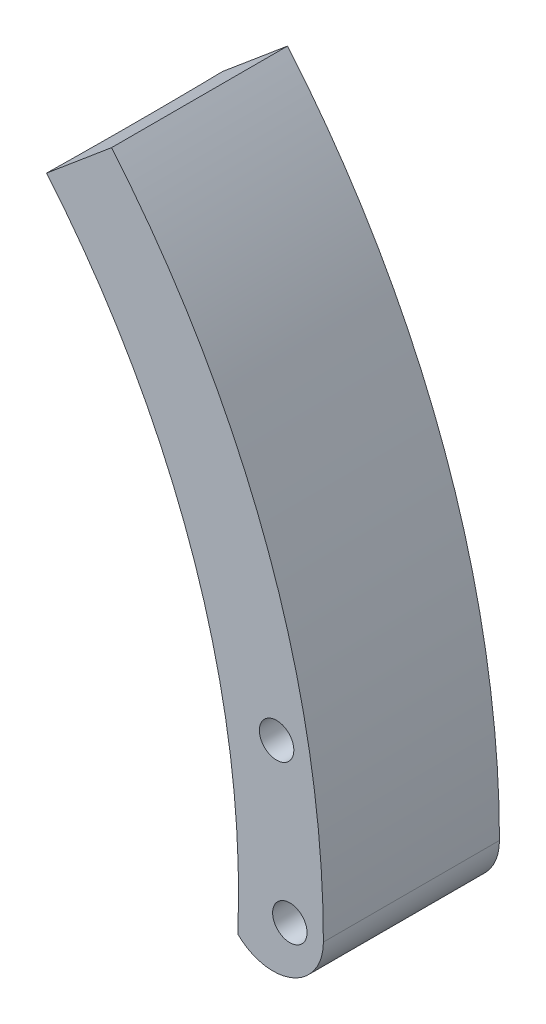
ISO-10303-21;
HEADER;
FILE_DESCRIPTION(('STEP AP214'),'2;1');
FILE_NAME('part.step','',(''),(''),'','','');
FILE_SCHEMA(('AUTOMOTIVE_DESIGN { 1 0 10303 214 1 1 1 1 }'));
ENDSEC;
DATA;
#1=APPLICATION_CONTEXT('core data for automotive mechanical design processes');
#2=APPLICATION_PROTOCOL_DEFINITION('international standard','automotive_design',2000,#1);
#3=PRODUCT_CONTEXT('',#1,'mechanical');
#4=PRODUCT('Part','Part','',(#3));
#5=PRODUCT_RELATED_PRODUCT_CATEGORY('part','',(#4));
#6=PRODUCT_DEFINITION_FORMATION('','',#4);
#7=PRODUCT_DEFINITION_CONTEXT('part definition',#1,'design');
#8=PRODUCT_DEFINITION('design','',#6,#7);
#9=PRODUCT_DEFINITION_SHAPE('','',#8);
#10=(LENGTH_UNIT() NAMED_UNIT(*) SI_UNIT(.MILLI.,.METRE.));
#11=(NAMED_UNIT(*) PLANE_ANGLE_UNIT() SI_UNIT($,.RADIAN.));
#12=(NAMED_UNIT(*) SI_UNIT($,.STERADIAN.) SOLID_ANGLE_UNIT());
#13=UNCERTAINTY_MEASURE_WITH_UNIT(LENGTH_MEASURE(1.E-05),#10,'distance_accuracy_value','');
#14=(GEOMETRIC_REPRESENTATION_CONTEXT(3) GLOBAL_UNCERTAINTY_ASSIGNED_CONTEXT((#13)) GLOBAL_UNIT_ASSIGNED_CONTEXT((#10,
#11,#12)) REPRESENTATION_CONTEXT('',''));
#15=CARTESIAN_POINT('',(0.,0.,0.));
#16=DIRECTION('',(0.,0.,1.));
#17=DIRECTION('',(1.,0.,0.));
#18=AXIS2_PLACEMENT_3D('',#15,#16,#17);
#19=CARTESIAN_POINT('',(161.925,0.,-16.66875));
#20=DIRECTION('',(0.,0.,1.));
#21=DIRECTION('',(1.,0.,0.));
#22=AXIS2_PLACEMENT_3D('',#19,#20,#21);
#23=CYLINDRICAL_SURFACE('',#22,9.52500000000001);
#24=CARTESIAN_POINT('',(155.240875398303,-6.78587527950434,-16.66895));
#25=CARTESIAN_POINT('',(155.292003784145,-6.83622169072267,-16.2737696493296));
#26=CARTESIAN_POINT('',(155.341380564089,-6.88373509715529,-15.8780088997003));
#27=CARTESIAN_POINT('',(155.436588080032,-6.97355526704699,-15.0854829875638));
#28=CARTESIAN_POINT('',(155.482418926421,-7.01586219261438,-14.6887178567215));
#29=CARTESIAN_POINT('',(155.570488783143,-7.09572626914462,-13.8943704024371));
#30=CARTESIAN_POINT('',(155.61272829417,-7.13328408257406,-13.4967882008509));
#31=CARTESIAN_POINT('',(155.693590647385,-7.20402966531052,-12.7008677835376));
#32=CARTESIAN_POINT('',(155.732213457298,-7.2372173956221,-12.3025295610965));
#33=CARTESIAN_POINT('',(155.84258695008,-7.33070481016805,-11.106833406468));
#34=CARTESIAN_POINT('',(155.908876799243,-7.38495906962129,-10.3084866262595));
#35=CARTESIAN_POINT('',(156.026719447702,-7.47941051696097,-8.70986502922471));
#36=CARTESIAN_POINT('',(156.078271631594,-7.51960711785366,-7.90959013329239));
#37=CARTESIAN_POINT('',(156.166162541758,-7.58712456357242,-6.31422609213651));
#38=CARTESIAN_POINT('',(156.202621947523,-7.61454777281125,-5.51914790170818));
#39=CARTESIAN_POINT('',(156.260854233751,-7.65796267329711,-3.92815482844718));
#40=CARTESIAN_POINT('',(156.28262727912,-7.67395449290091,-3.13223995510964));
#41=CARTESIAN_POINT('',(156.311447604712,-7.69506140852962,-1.53991076390729));
#42=CARTESIAN_POINT('',(156.31849319805,-7.70017525859015,-0.743496399279939));
#43=CARTESIAN_POINT('',(156.317840082136,-7.69970067281009,0.84931900388392));
#44=CARTESIAN_POINT('',(156.310141527348,-7.69411234908794,1.64572004247263));
#45=CARTESIAN_POINT('',(156.283836468499,-7.674833764763,3.03613614023559));
#46=CARTESIAN_POINT('',(156.268491912639,-7.6635579818308,3.630249545158));
#47=CARTESIAN_POINT('',(156.229615089527,-7.63471072303618,4.81805422148067));
#48=CARTESIAN_POINT('',(156.206082883407,-7.61713929417984,5.41174549599957));
#49=CARTESIAN_POINT('',(156.150861873912,-7.57536481767639,6.5984027948953));
#50=CARTESIAN_POINT('',(156.119174620722,-7.55116303033206,7.19136893561188));
#51=CARTESIAN_POINT('',(156.047679031593,-7.49565030071249,8.37646652279023));
#52=CARTESIAN_POINT('',(156.007870884151,-7.46433952344464,8.96859798830478));
#53=CARTESIAN_POINT('',(155.919913362784,-7.39376505617362,10.1554361328379));
#54=CARTESIAN_POINT('',(155.87171430802,-7.35445374801531,10.7501363205944));
#55=CARTESIAN_POINT('',(155.767212363434,-7.26718050352098,11.9381765521273));
#56=CARTESIAN_POINT('',(155.710909667833,-7.21921877450374,12.5315166281556));
#57=CARTESIAN_POINT('',(155.590259588021,-7.11358789294299,13.7167782222486));
#58=CARTESIAN_POINT('',(155.525908842796,-7.05591468119933,14.3086990417286));
#59=CARTESIAN_POINT('',(155.423448247704,-6.96114971506755,15.1950277472884));
#60=CARTESIAN_POINT('',(155.388303916495,-6.928183860907,15.4902251821854));
#61=CARTESIAN_POINT('',(155.316055152094,-6.85929685542576,16.0800391626944));
#62=CARTESIAN_POINT('',(155.278950688455,-6.82337565819325,16.3746556992092));
#63=CARTESIAN_POINT('',(155.240875398303,-6.78587527950434,16.66895));
#64=B_SPLINE_CURVE_WITH_KNOTS('',3,(#24,#25,#26,#27,#28,#29,#30,#31,#32,#33,#34,#35,#36,#37,#38,
#39,#40,#41,#42,#43,#44,#45,#46,#47,#48,#49,#50,#51,#52,#53,#54,#55,#56,#57,#58,#59,#60,#61,#62,
#63),.UNSPECIFIED.,.F.,.F.,(4,2,2,2,2,2,2,2,2,2,2,2,2,2,2,2,2,2,2,4),(0.,1.20490167267044,
2.40976582018349,3.6144617120698,4.81916835306003,7.22764975938458,9.6362317226256,
12.0251646323479,14.4140707176391,16.8032504138843,19.1924050806684,20.9755773156493,
22.7587362369552,24.5415564491615,26.3243352844005,28.1180527674387,29.9117272673757,
31.7061533558759,32.603447392115,33.5007553706228),.UNSPECIFIED.);
#65=CARTESIAN_POINT('',(155.240901273664,-6.78590076678086,-16.66875));
#66=VERTEX_POINT('',#65);
#67=CARTESIAN_POINT('',(155.240901273664,-6.78590076678088,16.66875));
#68=VERTEX_POINT('',#67);
#69=EDGE_CURVE('E50',#66,#68,#64,.T.);
#70=ORIENTED_EDGE('',*,*,#69,.F.);
#71=CARTESIAN_POINT('',(161.925,0.,-16.66875));
#72=DIRECTION('',(0.,0.,1.));
#73=DIRECTION('',(1.,0.,0.));
#74=AXIS2_PLACEMENT_3D('',#71,#72,#73);
#75=CIRCLE('',#74,9.52500000000001);
#76=CARTESIAN_POINT('',(171.45,0.,-16.66875));
#77=VERTEX_POINT('',#76);
#78=EDGE_CURVE('E100',#66,#77,#75,.T.);
#79=ORIENTED_EDGE('',*,*,#78,.T.);
#80=DIRECTION('',(0.,0.,1.));
#81=VECTOR('',#80,1.);
#82=CARTESIAN_POINT('',(171.45,0.,-16.66875));
#83=LINE('',#82,#81);
#84=CARTESIAN_POINT('',(171.45,0.,16.66875));
#85=VERTEX_POINT('',#84);
#86=EDGE_CURVE('E106',#77,#85,#83,.T.);
#87=ORIENTED_EDGE('',*,*,#86,.T.);
#88=CARTESIAN_POINT('',(161.925,0.,16.66875));
#89=DIRECTION('',(0.,0.,1.));
#90=DIRECTION('',(1.,0.,0.));
#91=AXIS2_PLACEMENT_3D('',#88,#89,#90);
#92=CIRCLE('',#91,9.52500000000001);
#93=EDGE_CURVE('E94',#68,#85,#92,.T.);
#94=ORIENTED_EDGE('',*,*,#93,.F.);
#95=EDGE_LOOP('',(#70,#79,#87,#94));
#96=FACE_BOUND('',#95,.T.);
#97=ADVANCED_FACE('F36',(#96),#23,.T.);
#98=CARTESIAN_POINT('',(116.745173131332,97.9608317162288,-16.66875));
#99=DIRECTION('',(-0.64278760968654,0.766044443118978,0.));
#100=DIRECTION('',(-0.766044443118978,-0.64278760968654,0.));
#101=AXIS2_PLACEMENT_3D('',#98,#99,#100);
#102=PLANE('',#101);
#103=CARTESIAN_POINT('',(24.3219110690275,20.4085066075476,0.));
#104=DIRECTION('',(-0.64278760968654,0.766044443118978,0.));
#105=DIRECTION('',(-0.766044443118978,-0.64278760968654,0.));
#106=AXIS2_PLACEMENT_3D('',#103,#104,#105);
#107=CIRCLE('',#106,124.757705172867);
#108=CARTESIAN_POINT('',(119.034989800133,99.8822160384836,16.66875));
#109=VERTEX_POINT('',#108);
#110=CARTESIAN_POINT('',(119.034989800134,99.8822160384835,-16.66875));
#111=VERTEX_POINT('',#110);
#112=EDGE_CURVE('E75',#109,#111,#107,.T.);
#113=ORIENTED_EDGE('',*,*,#112,.F.);
#114=DIRECTION('',(-0.766044443118977,-0.64278760968654,0.));
#115=VECTOR('',#114,1.);
#116=CARTESIAN_POINT('',(116.745173131332,97.9608317162288,16.66875));
#117=LINE('',#116,#115);
#118=CARTESIAN_POINT('',(131.338319772749,110.205935680757,16.66875));
#119=VERTEX_POINT('',#118);
#120=EDGE_CURVE('E81',#119,#109,#117,.T.);
#121=ORIENTED_EDGE('',*,*,#120,.F.);
#122=DIRECTION('',(0.,0.,1.));
#123=VECTOR('',#122,1.);
#124=CARTESIAN_POINT('',(131.338319772749,110.205935680757,-16.66875));
#125=LINE('',#124,#123);
#126=CARTESIAN_POINT('',(131.338319772749,110.205935680757,-16.66875));
#127=VERTEX_POINT('',#126);
#128=EDGE_CURVE('E44',#127,#119,#125,.T.);
#129=ORIENTED_EDGE('',*,*,#128,.F.);
#130=DIRECTION('',(-0.766044443118977,-0.64278760968654,0.));
#131=VECTOR('',#130,1.);
#132=CARTESIAN_POINT('',(116.745173131332,97.9608317162288,-16.66875));
#133=LINE('',#132,#131);
#134=EDGE_CURVE('E82',#127,#111,#133,.T.);
#135=ORIENTED_EDGE('',*,*,#134,.T.);
#136=EDGE_LOOP('',(#113,#121,#129,#135));
#137=FACE_BOUND('',#136,.T.);
#138=ADVANCED_FACE('F80',(#137),#102,.T.);
#139=CARTESIAN_POINT('',(0.,0.,-16.66875));
#140=DIRECTION('',(0.,0.,1.));
#141=DIRECTION('',(1.,0.,0.));
#142=AXIS2_PLACEMENT_3D('',#139,#140,#141);
#143=CYLINDRICAL_SURFACE('',#142,171.45);
#144=ORIENTED_EDGE('',*,*,#128,.T.);
#145=CARTESIAN_POINT('',(0.,0.,16.66875));
#146=DIRECTION('',(0.,0.,1.));
#147=DIRECTION('',(1.,0.,0.));
#148=AXIS2_PLACEMENT_3D('',#145,#146,#147);
#149=CIRCLE('',#148,171.45);
#150=EDGE_CURVE('E88',#85,#119,#149,.T.);
#151=ORIENTED_EDGE('',*,*,#150,.F.);
#152=ORIENTED_EDGE('',*,*,#86,.F.);
#153=CARTESIAN_POINT('',(0.,0.,-16.66875));
#154=DIRECTION('',(0.,0.,1.));
#155=DIRECTION('',(1.,0.,0.));
#156=AXIS2_PLACEMENT_3D('',#153,#154,#155);
#157=CIRCLE('',#156,171.45);
#158=EDGE_CURVE('E102',#77,#127,#157,.T.);
#159=ORIENTED_EDGE('',*,*,#158,.T.);
#160=EDGE_LOOP('',(#144,#151,#152,#159));
#161=FACE_BOUND('',#160,.T.);
#162=ADVANCED_FACE('F113',(#161),#143,.T.);
#163=CARTESIAN_POINT('',(161.925,0.,-16.66875));
#164=DIRECTION('',(0.,0.,1.));
#165=DIRECTION('',(1.,0.,0.));
#166=AXIS2_PLACEMENT_3D('',#163,#164,#165);
#167=PLANE('',#166);
#168=CARTESIAN_POINT('',(162.591760022316,28.6693141328104,-16.66875));
#169=DIRECTION('',(0.,0.,1.));
#170=DIRECTION('',(1.,0.,0.));
#171=AXIS2_PLACEMENT_3D('',#168,#169,#170);
#172=CIRCLE('',#171,3.26390000000001);
#173=CARTESIAN_POINT('',(165.855660022316,28.6693141328104,-16.66875));
#174=VERTEX_POINT('',#173);
#175=EDGE_CURVE('E89',#174,#174,#172,.T.);
#176=ORIENTED_EDGE('',*,*,#175,.T.);
#177=EDGE_LOOP('',(#176));
#178=FACE_BOUND('',#177,.T.);
#179=CARTESIAN_POINT('',(165.1,0.,-16.66875));
#180=DIRECTION('',(0.,0.,1.));
#181=DIRECTION('',(1.,0.,0.));
#182=AXIS2_PLACEMENT_3D('',#179,#180,#181);
#183=CIRCLE('',#182,3.26390000000001);
#184=CARTESIAN_POINT('',(168.3639,0.,-16.66875));
#185=VERTEX_POINT('',#184);
#186=EDGE_CURVE('E92',#185,#185,#183,.T.);
#187=ORIENTED_EDGE('',*,*,#186,.T.);
#188=EDGE_LOOP('',(#187));
#189=FACE_BOUND('',#188,.T.);
#190=ORIENTED_EDGE('',*,*,#78,.F.);
#191=CARTESIAN_POINT('',(0.,0.,-16.66875));
#192=DIRECTION('',(0.,0.,1.));
#193=DIRECTION('',(1.,0.,0.));
#194=AXIS2_PLACEMENT_3D('',#191,#192,#193);
#195=CIRCLE('',#194,155.389143370688);
#196=EDGE_CURVE('E116',#66,#111,#195,.T.);
#197=ORIENTED_EDGE('',*,*,#196,.T.);
#198=ORIENTED_EDGE('',*,*,#134,.F.);
#199=ORIENTED_EDGE('',*,*,#158,.F.);
#200=EDGE_LOOP('',(#190,#197,#198,#199));
#201=FACE_BOUND('',#200,.T.);
#202=ADVANCED_FACE('F115',(#178,#189,#201),#167,.F.);
#203=CARTESIAN_POINT('',(165.1,0.,-16.66875));
#204=DIRECTION('',(0.,0.,1.));
#205=DIRECTION('',(1.,0.,0.));
#206=AXIS2_PLACEMENT_3D('',#203,#204,#205);
#207=CYLINDRICAL_SURFACE('',#206,3.26390000000001);
#208=ORIENTED_EDGE('',*,*,#186,.F.);
#209=EDGE_LOOP('',(#208));
#210=FACE_BOUND('',#209,.T.);
#211=CARTESIAN_POINT('',(165.1,0.,16.66875));
#212=DIRECTION('',(0.,0.,1.));
#213=DIRECTION('',(1.,0.,0.));
#214=AXIS2_PLACEMENT_3D('',#211,#212,#213);
#215=CIRCLE('',#214,3.26390000000001);
#216=CARTESIAN_POINT('',(168.3639,0.,16.66875));
#217=VERTEX_POINT('',#216);
#218=EDGE_CURVE('E120',#217,#217,#215,.T.);
#219=ORIENTED_EDGE('',*,*,#218,.T.);
#220=EDGE_LOOP('',(#219));
#221=FACE_BOUND('',#220,.T.);
#222=ADVANCED_FACE('F132',(#210,#221),#207,.F.);
#223=CARTESIAN_POINT('',(162.591760022316,28.6693141328104,-16.66875));
#224=DIRECTION('',(0.,0.,1.));
#225=DIRECTION('',(1.,0.,0.));
#226=AXIS2_PLACEMENT_3D('',#223,#224,#225);
#227=CYLINDRICAL_SURFACE('',#226,3.26390000000001);
#228=ORIENTED_EDGE('',*,*,#175,.F.);
#229=EDGE_LOOP('',(#228));
#230=FACE_BOUND('',#229,.T.);
#231=CARTESIAN_POINT('',(162.591760022316,28.6693141328104,16.66875));
#232=DIRECTION('',(0.,0.,1.));
#233=DIRECTION('',(1.,0.,0.));
#234=AXIS2_PLACEMENT_3D('',#231,#232,#233);
#235=CIRCLE('',#234,3.26390000000001);
#236=CARTESIAN_POINT('',(165.855660022316,28.6693141328104,16.66875));
#237=VERTEX_POINT('',#236);
#238=EDGE_CURVE('E117',#237,#237,#235,.T.);
#239=ORIENTED_EDGE('',*,*,#238,.T.);
#240=EDGE_LOOP('',(#239));
#241=FACE_BOUND('',#240,.T.);
#242=ADVANCED_FACE('F135',(#230,#241),#227,.F.);
#243=CARTESIAN_POINT('',(161.925,0.,16.66875));
#244=DIRECTION('',(0.,0.,1.));
#245=DIRECTION('',(1.,0.,0.));
#246=AXIS2_PLACEMENT_3D('',#243,#244,#245);
#247=PLANE('',#246);
#248=CARTESIAN_POINT('',(0.,0.,16.66875));
#249=DIRECTION('',(0.,0.,1.));
#250=DIRECTION('',(1.,0.,0.));
#251=AXIS2_PLACEMENT_3D('',#248,#249,#250);
#252=CIRCLE('',#251,155.389143370688);
#253=EDGE_CURVE('E11',#68,#109,#252,.T.);
#254=ORIENTED_EDGE('',*,*,#253,.F.);
#255=ORIENTED_EDGE('',*,*,#93,.T.);
#256=ORIENTED_EDGE('',*,*,#150,.T.);
#257=ORIENTED_EDGE('',*,*,#120,.T.);
#258=EDGE_LOOP('',(#254,#255,#256,#257));
#259=FACE_BOUND('',#258,.T.);
#260=ORIENTED_EDGE('',*,*,#218,.F.);
#261=EDGE_LOOP('',(#260));
#262=FACE_BOUND('',#261,.T.);
#263=ORIENTED_EDGE('',*,*,#238,.F.);
#264=EDGE_LOOP('',(#263));
#265=FACE_BOUND('',#264,.T.);
#266=ADVANCED_FACE('F85',(#259,#262,#265),#247,.T.);
#267=CARTESIAN_POINT('',(0.,0.,1.11022302462516E-13));
#268=DIRECTION('',(0.,0.,1.));
#269=DIRECTION('',(1.,0.,0.));
#270=AXIS2_PLACEMENT_3D('',#267,#268,#269);
#271=DEGENERATE_TOROIDAL_SURFACE('',#270,31.75,124.757705172867,.T.);
#272=ORIENTED_EDGE('',*,*,#69,.T.);
#273=ORIENTED_EDGE('',*,*,#253,.T.);
#274=ORIENTED_EDGE('',*,*,#112,.T.);
#275=ORIENTED_EDGE('',*,*,#196,.F.);
#276=EDGE_LOOP('',(#272,#273,#274,#275));
#277=FACE_BOUND('',#276,.T.);
#278=ADVANCED_FACE('F74',(#277),#271,.F.);
#279=CLOSED_SHELL('',(#97,#138,#162,#202,#222,#242,#266,#278));
#280=MANIFOLD_SOLID_BREP('B2',#279);
#281=ADVANCED_BREP_SHAPE_REPRESENTATION('',(#18,#280),#14);
#282=SHAPE_DEFINITION_REPRESENTATION(#9,#281);
ENDSEC;
END-ISO-10303-21;
